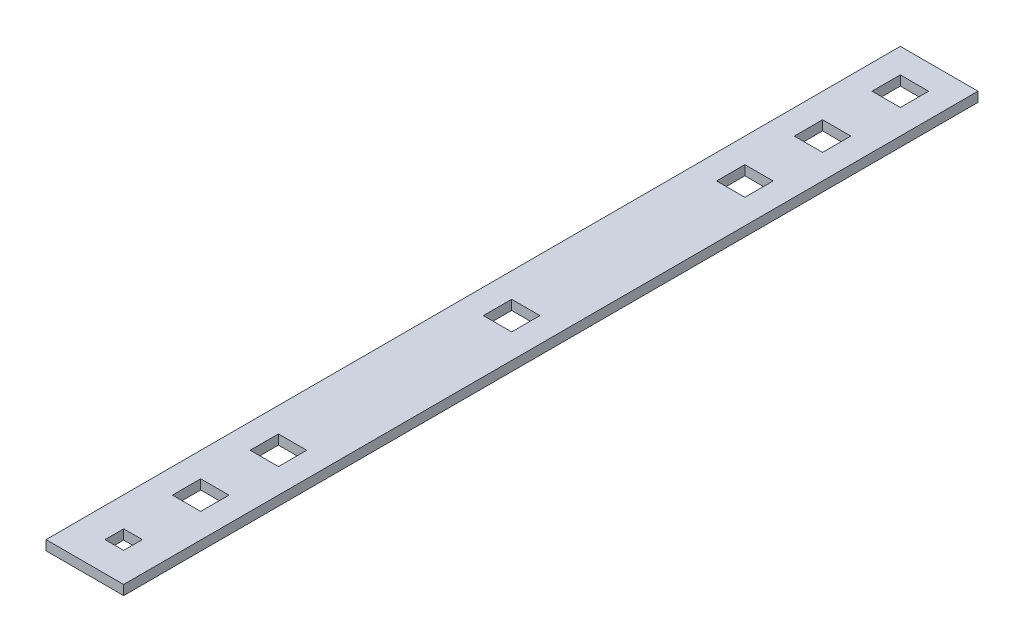
ISO-10303-21;
HEADER;
FILE_DESCRIPTION(('STEP AP214'),'2;1');
FILE_NAME('part.step','',(''),(''),'','','');
FILE_SCHEMA(('AUTOMOTIVE_DESIGN { 1 0 10303 214 1 1 1 1 }'));
ENDSEC;
DATA;
#1=APPLICATION_CONTEXT('core data for automotive mechanical design processes');
#2=APPLICATION_PROTOCOL_DEFINITION('international standard','automotive_design',2000,#1);
#3=PRODUCT_CONTEXT('',#1,'mechanical');
#4=PRODUCT('Part','Part','',(#3));
#5=PRODUCT_RELATED_PRODUCT_CATEGORY('part','',(#4));
#6=PRODUCT_DEFINITION_FORMATION('','',#4);
#7=PRODUCT_DEFINITION_CONTEXT('part definition',#1,'design');
#8=PRODUCT_DEFINITION('design','',#6,#7);
#9=PRODUCT_DEFINITION_SHAPE('','',#8);
#10=(LENGTH_UNIT() NAMED_UNIT(*) SI_UNIT(.MILLI.,.METRE.));
#11=(NAMED_UNIT(*) PLANE_ANGLE_UNIT() SI_UNIT($,.RADIAN.));
#12=(NAMED_UNIT(*) SI_UNIT($,.STERADIAN.) SOLID_ANGLE_UNIT());
#13=UNCERTAINTY_MEASURE_WITH_UNIT(LENGTH_MEASURE(1.E-05),#10,'distance_accuracy_value','');
#14=(GEOMETRIC_REPRESENTATION_CONTEXT(3) GLOBAL_UNCERTAINTY_ASSIGNED_CONTEXT((#13)) GLOBAL_UNIT_ASSIGNED_CONTEXT((#10,
#11,#12)) REPRESENTATION_CONTEXT('',''));
#15=CARTESIAN_POINT('',(0.,0.,0.));
#16=DIRECTION('',(0.,0.,1.));
#17=DIRECTION('',(1.,0.,0.));
#18=AXIS2_PLACEMENT_3D('',#15,#16,#17);
#19=CARTESIAN_POINT('',(0.,1.5875,0.));
#20=DIRECTION('',(0.,1.,0.));
#21=DIRECTION('',(0.,0.,1.));
#22=AXIS2_PLACEMENT_3D('',#19,#20,#21);
#23=PLANE('',#22);
#24=DIRECTION('',(0.,0.,1.));
#25=VECTOR('',#24,1.);
#26=CARTESIAN_POINT('',(-0.0370878442756614,1.5875,-101.537542425712));
#27=LINE('',#26,#25);
#28=CARTESIAN_POINT('',(-0.0370878442756614,1.5875,-101.537542425712));
#29=VERTEX_POINT('',#28);
#30=CARTESIAN_POINT('',(-0.0370878442756614,1.5875,38.1624575742885));
#31=VERTEX_POINT('',#30);
#32=EDGE_CURVE('E466',#29,#31,#27,.T.);
#33=ORIENTED_EDGE('',*,*,#32,.T.);
#34=DIRECTION('',(1.,0.,0.));
#35=VECTOR('',#34,1.);
#36=CARTESIAN_POINT('',(-0.0370878442756614,1.5875,38.1624575742885));
#37=LINE('',#36,#35);
#38=CARTESIAN_POINT('',(12.6629121557243,1.5875,38.1624575742885));
#39=VERTEX_POINT('',#38);
#40=EDGE_CURVE('E469',#31,#39,#37,.T.);
#41=ORIENTED_EDGE('',*,*,#40,.T.);
#42=DIRECTION('',(0.,0.,-1.));
#43=VECTOR('',#42,1.);
#44=CARTESIAN_POINT('',(12.6629121557243,1.5875,-101.537542425712));
#45=LINE('',#44,#43);
#46=CARTESIAN_POINT('',(12.6629121557243,1.5875,-101.537542425712));
#47=VERTEX_POINT('',#46);
#48=EDGE_CURVE('E472',#39,#47,#45,.T.);
#49=ORIENTED_EDGE('',*,*,#48,.T.);
#50=DIRECTION('',(-1.,0.,0.));
#51=VECTOR('',#50,1.);
#52=CARTESIAN_POINT('',(-0.0370878442756614,1.5875,-101.537542425712));
#53=LINE('',#52,#51);
#54=EDGE_CURVE('E474',#47,#29,#53,.T.);
#55=ORIENTED_EDGE('',*,*,#54,.T.);
#56=EDGE_LOOP('',(#33,#41,#49,#55));
#57=FACE_BOUND('',#56,.T.);
#58=DIRECTION('',(1.,0.,0.));
#59=VECTOR('',#58,1.);
#60=CARTESIAN_POINT('',(4.00011215572342,1.5875,-92.8747424257115));
#61=LINE('',#60,#59);
#62=CARTESIAN_POINT('',(4.00011215572342,1.5875,-92.8747424257115));
#63=VERTEX_POINT('',#62);
#64=CARTESIAN_POINT('',(8.62291215572434,1.5875,-92.8747424257115));
#65=VERTEX_POINT('',#64);
#66=EDGE_CURVE('E437',#63,#65,#61,.T.);
#67=ORIENTED_EDGE('',*,*,#66,.F.);
#68=DIRECTION('',(-1.99259791845567E-13,0.,1.));
#69=VECTOR('',#68,1.);
#70=CARTESIAN_POINT('',(4.00011215572434,1.5875,-97.4975424257115));
#71=LINE('',#70,#69);
#72=CARTESIAN_POINT('',(4.00011215572434,1.5875,-97.4975424257115));
#73=VERTEX_POINT('',#72);
#74=EDGE_CURVE('E435',#73,#63,#71,.T.);
#75=ORIENTED_EDGE('',*,*,#74,.F.);
#76=DIRECTION('',(-1.,0.,0.));
#77=VECTOR('',#76,1.);
#78=CARTESIAN_POINT('',(4.00011215572434,1.5875,-97.4975424257115));
#79=LINE('',#78,#77);
#80=CARTESIAN_POINT('',(8.62291215572434,1.5875,-97.4975424257115));
#81=VERTEX_POINT('',#80);
#82=EDGE_CURVE('E443',#81,#73,#79,.T.);
#83=ORIENTED_EDGE('',*,*,#82,.F.);
#84=DIRECTION('',(0.,0.,-1.));
#85=VECTOR('',#84,1.);
#86=CARTESIAN_POINT('',(8.62291215572434,1.5875,-97.4975424257115));
#87=LINE('',#86,#85);
#88=EDGE_CURVE('E440',#65,#81,#87,.T.);
#89=ORIENTED_EDGE('',*,*,#88,.F.);
#90=EDGE_LOOP('',(#67,#75,#83,#89));
#91=FACE_BOUND('',#90,.T.);
#92=DIRECTION('',(1.,0.,0.));
#93=VECTOR('',#92,1.);
#94=CARTESIAN_POINT('',(4.78991215572435,1.5875,33.3374575742885));
#95=LINE('',#94,#93);
#96=CARTESIAN_POINT('',(4.78991215572435,1.5875,33.3374575742885));
#97=VERTEX_POINT('',#96);
#98=CARTESIAN_POINT('',(7.83791215572435,1.5875,33.3374575742885));
#99=VERTEX_POINT('',#98);
#100=EDGE_CURVE('E406',#97,#99,#95,.T.);
#101=ORIENTED_EDGE('',*,*,#100,.F.);
#102=DIRECTION('',(0.,0.,1.));
#103=VECTOR('',#102,1.);
#104=CARTESIAN_POINT('',(4.78991215572435,1.5875,30.2894575742885));
#105=LINE('',#104,#103);
#106=CARTESIAN_POINT('',(4.78991215572435,1.5875,30.2894575742885));
#107=VERTEX_POINT('',#106);
#108=EDGE_CURVE('E404',#107,#97,#105,.T.);
#109=ORIENTED_EDGE('',*,*,#108,.F.);
#110=DIRECTION('',(-1.,0.,0.));
#111=VECTOR('',#110,1.);
#112=CARTESIAN_POINT('',(4.78991215572435,1.5875,30.2894575742885));
#113=LINE('',#112,#111);
#114=CARTESIAN_POINT('',(7.83791215572435,1.5875,30.2894575742885));
#115=VERTEX_POINT('',#114);
#116=EDGE_CURVE('E412',#115,#107,#113,.T.);
#117=ORIENTED_EDGE('',*,*,#116,.F.);
#118=DIRECTION('',(0.,0.,-1.));
#119=VECTOR('',#118,1.);
#120=CARTESIAN_POINT('',(7.83791215572435,1.5875,30.2894575742885));
#121=LINE('',#120,#119);
#122=EDGE_CURVE('E409',#99,#115,#121,.T.);
#123=ORIENTED_EDGE('',*,*,#122,.F.);
#124=EDGE_LOOP('',(#101,#109,#117,#123));
#125=FACE_BOUND('',#124,.T.);
#126=DIRECTION('',(-1.99259791845567E-13,0.,1.));
#127=VECTOR('',#126,1.);
#128=CARTESIAN_POINT('',(4.00011215572447,1.5875,-84.7862636482007));
#129=LINE('',#128,#127);
#130=CARTESIAN_POINT('',(4.00011215572447,1.5875,-84.7862636482007));
#131=VERTEX_POINT('',#130);
#132=CARTESIAN_POINT('',(4.00011215572355,1.5875,-80.1634636482007));
#133=VERTEX_POINT('',#132);
#134=EDGE_CURVE('E375',#131,#133,#129,.T.);
#135=ORIENTED_EDGE('',*,*,#134,.F.);
#136=DIRECTION('',(-1.,0.,0.));
#137=VECTOR('',#136,1.);
#138=CARTESIAN_POINT('',(4.00011215572447,1.5875,-84.7862636482007));
#139=LINE('',#138,#137);
#140=CARTESIAN_POINT('',(8.62291215572447,1.5875,-84.7862636482007));
#141=VERTEX_POINT('',#140);
#142=EDGE_CURVE('E373',#141,#131,#139,.T.);
#143=ORIENTED_EDGE('',*,*,#142,.F.);
#144=DIRECTION('',(0.,0.,-1.));
#145=VECTOR('',#144,1.);
#146=CARTESIAN_POINT('',(8.62291215572447,1.5875,-84.7862636482007));
#147=LINE('',#146,#145);
#148=CARTESIAN_POINT('',(8.62291215572447,1.5875,-80.1634636482007));
#149=VERTEX_POINT('',#148);
#150=EDGE_CURVE('E381',#149,#141,#147,.T.);
#151=ORIENTED_EDGE('',*,*,#150,.F.);
#152=DIRECTION('',(1.,0.,0.));
#153=VECTOR('',#152,1.);
#154=CARTESIAN_POINT('',(4.00011215572355,1.5875,-80.1634636482007));
#155=LINE('',#154,#153);
#156=EDGE_CURVE('E378',#133,#149,#155,.T.);
#157=ORIENTED_EDGE('',*,*,#156,.F.);
#158=EDGE_LOOP('',(#135,#143,#151,#157));
#159=FACE_BOUND('',#158,.T.);
#160=DIRECTION('',(-1.99259791845567E-13,0.,1.));
#161=VECTOR('',#160,1.);
#162=CARTESIAN_POINT('',(4.0001121557246,1.5875,-72.0749848706899));
#163=LINE('',#162,#161);
#164=CARTESIAN_POINT('',(4.0001121557246,1.5875,-72.0749848706899));
#165=VERTEX_POINT('',#164);
#166=CARTESIAN_POINT('',(4.00011215572368,1.5875,-67.4521848706899));
#167=VERTEX_POINT('',#166);
#168=EDGE_CURVE('E344',#165,#167,#163,.T.);
#169=ORIENTED_EDGE('',*,*,#168,.F.);
#170=DIRECTION('',(-1.,0.,0.));
#171=VECTOR('',#170,1.);
#172=CARTESIAN_POINT('',(4.0001121557246,1.5875,-72.0749848706899));
#173=LINE('',#172,#171);
#174=CARTESIAN_POINT('',(8.6229121557246,1.5875,-72.0749848706899));
#175=VERTEX_POINT('',#174);
#176=EDGE_CURVE('E342',#175,#165,#173,.T.);
#177=ORIENTED_EDGE('',*,*,#176,.F.);
#178=DIRECTION('',(0.,0.,-1.));
#179=VECTOR('',#178,1.);
#180=CARTESIAN_POINT('',(8.6229121557246,1.5875,-72.0749848706899));
#181=LINE('',#180,#179);
#182=CARTESIAN_POINT('',(8.6229121557246,1.5875,-67.4521848706899));
#183=VERTEX_POINT('',#182);
#184=EDGE_CURVE('E350',#183,#175,#181,.T.);
#185=ORIENTED_EDGE('',*,*,#184,.F.);
#186=DIRECTION('',(1.,0.,0.));
#187=VECTOR('',#186,1.);
#188=CARTESIAN_POINT('',(4.00011215572368,1.5875,-67.4521848706899));
#189=LINE('',#188,#187);
#190=EDGE_CURVE('E347',#167,#183,#189,.T.);
#191=ORIENTED_EDGE('',*,*,#190,.F.);
#192=EDGE_LOOP('',(#169,#177,#185,#191));
#193=FACE_BOUND('',#192,.T.);
#194=DIRECTION('',(-1.99259791845567E-13,0.,1.));
#195=VECTOR('',#194,1.);
#196=CARTESIAN_POINT('',(4.000112155725,1.5875,-33.9411485381575));
#197=LINE('',#196,#195);
#198=CARTESIAN_POINT('',(4.000112155725,1.5875,-33.9411485381575));
#199=VERTEX_POINT('',#198);
#200=CARTESIAN_POINT('',(4.00011215572408,1.5875,-29.3183485381575));
#201=VERTEX_POINT('',#200);
#202=EDGE_CURVE('E313',#199,#201,#197,.T.);
#203=ORIENTED_EDGE('',*,*,#202,.F.);
#204=DIRECTION('',(-1.,0.,0.));
#205=VECTOR('',#204,1.);
#206=CARTESIAN_POINT('',(4.000112155725,1.5875,-33.9411485381575));
#207=LINE('',#206,#205);
#208=CARTESIAN_POINT('',(8.622912155725,1.5875,-33.9411485381575));
#209=VERTEX_POINT('',#208);
#210=EDGE_CURVE('E311',#209,#199,#207,.T.);
#211=ORIENTED_EDGE('',*,*,#210,.F.);
#212=DIRECTION('',(0.,0.,-1.));
#213=VECTOR('',#212,1.);
#214=CARTESIAN_POINT('',(8.622912155725,1.5875,-33.9411485381575));
#215=LINE('',#214,#213);
#216=CARTESIAN_POINT('',(8.622912155725,1.5875,-29.3183485381575));
#217=VERTEX_POINT('',#216);
#218=EDGE_CURVE('E319',#217,#209,#215,.T.);
#219=ORIENTED_EDGE('',*,*,#218,.F.);
#220=DIRECTION('',(1.,0.,0.));
#221=VECTOR('',#220,1.);
#222=CARTESIAN_POINT('',(4.00011215572408,1.5875,-29.3183485381575));
#223=LINE('',#222,#221);
#224=EDGE_CURVE('E316',#201,#217,#223,.T.);
#225=ORIENTED_EDGE('',*,*,#224,.F.);
#226=EDGE_LOOP('',(#203,#211,#219,#225));
#227=FACE_BOUND('',#226,.T.);
#228=DIRECTION('',(-1.99259791845567E-13,0.,1.));
#229=VECTOR('',#228,1.);
#230=CARTESIAN_POINT('',(4.0001121557254,1.5875,4.19268779437487));
#231=LINE('',#230,#229);
#232=CARTESIAN_POINT('',(4.0001121557254,1.5875,4.19268779437487));
#233=VERTEX_POINT('',#232);
#234=CARTESIAN_POINT('',(4.00011215572448,1.5875,8.81548779437487));
#235=VERTEX_POINT('',#234);
#236=EDGE_CURVE('E282',#233,#235,#231,.T.);
#237=ORIENTED_EDGE('',*,*,#236,.F.);
#238=DIRECTION('',(-1.,0.,0.));
#239=VECTOR('',#238,1.);
#240=CARTESIAN_POINT('',(4.0001121557254,1.5875,4.19268779437487));
#241=LINE('',#240,#239);
#242=CARTESIAN_POINT('',(8.6229121557254,1.5875,4.19268779437487));
#243=VERTEX_POINT('',#242);
#244=EDGE_CURVE('E280',#243,#233,#241,.T.);
#245=ORIENTED_EDGE('',*,*,#244,.F.);
#246=DIRECTION('',(0.,0.,-1.));
#247=VECTOR('',#246,1.);
#248=CARTESIAN_POINT('',(8.6229121557254,1.5875,4.19268779437487));
#249=LINE('',#248,#247);
#250=CARTESIAN_POINT('',(8.6229121557254,1.5875,8.81548779437487));
#251=VERTEX_POINT('',#250);
#252=EDGE_CURVE('E288',#251,#243,#249,.T.);
#253=ORIENTED_EDGE('',*,*,#252,.F.);
#254=DIRECTION('',(1.,0.,0.));
#255=VECTOR('',#254,1.);
#256=CARTESIAN_POINT('',(4.00011215572448,1.5875,8.81548779437487));
#257=LINE('',#256,#255);
#258=EDGE_CURVE('E285',#235,#251,#257,.T.);
#259=ORIENTED_EDGE('',*,*,#258,.F.);
#260=EDGE_LOOP('',(#237,#245,#253,#259));
#261=FACE_BOUND('',#260,.T.);
#262=DIRECTION('',(-1.99259791845567E-13,0.,1.));
#263=VECTOR('',#262,1.);
#264=CARTESIAN_POINT('',(4.00011215572554,1.5875,16.9039665718857));
#265=LINE('',#264,#263);
#266=CARTESIAN_POINT('',(4.00011215572554,1.5875,16.9039665718857));
#267=VERTEX_POINT('',#266);
#268=CARTESIAN_POINT('',(4.00011215572462,1.5875,21.5267665718857));
#269=VERTEX_POINT('',#268);
#270=EDGE_CURVE('E252',#267,#269,#265,.T.);
#271=ORIENTED_EDGE('',*,*,#270,.F.);
#272=DIRECTION('',(-1.,0.,0.));
#273=VECTOR('',#272,1.);
#274=CARTESIAN_POINT('',(4.00011215572554,1.5875,16.9039665718857));
#275=LINE('',#274,#273);
#276=CARTESIAN_POINT('',(8.62291215572554,1.5875,16.9039665718857));
#277=VERTEX_POINT('',#276);
#278=EDGE_CURVE('E244',#277,#267,#275,.T.);
#279=ORIENTED_EDGE('',*,*,#278,.F.);
#280=DIRECTION('',(0.,0.,-1.));
#281=VECTOR('',#280,1.);
#282=CARTESIAN_POINT('',(8.62291215572554,1.5875,16.9039665718857));
#283=LINE('',#282,#281);
#284=CARTESIAN_POINT('',(8.62291215572554,1.5875,21.5267665718857));
#285=VERTEX_POINT('',#284);
#286=EDGE_CURVE('E266',#285,#277,#283,.T.);
#287=ORIENTED_EDGE('',*,*,#286,.F.);
#288=DIRECTION('',(1.,0.,0.));
#289=VECTOR('',#288,1.);
#290=CARTESIAN_POINT('',(4.00011215572462,1.5875,21.5267665718857));
#291=LINE('',#290,#289);
#292=EDGE_CURVE('E264',#269,#285,#291,.T.);
#293=ORIENTED_EDGE('',*,*,#292,.F.);
#294=EDGE_LOOP('',(#271,#279,#287,#293));
#295=FACE_BOUND('',#294,.T.);
#296=ADVANCED_FACE('F35',(#57,#91,#125,#159,#193,#227,#261,#295),#23,.T.);
#297=CARTESIAN_POINT('',(0.,0.,0.));
#298=DIRECTION('',(0.,1.,0.));
#299=DIRECTION('',(0.,0.,1.));
#300=AXIS2_PLACEMENT_3D('',#297,#298,#299);
#301=PLANE('',#300);
#302=DIRECTION('',(-1.,0.,0.));
#303=VECTOR('',#302,1.);
#304=CARTESIAN_POINT('',(4.0001121557254,0.,4.19268779437487));
#305=LINE('',#304,#303);
#306=CARTESIAN_POINT('',(8.6229121557254,0.,4.19268779437487));
#307=VERTEX_POINT('',#306);
#308=CARTESIAN_POINT('',(4.0001121557254,0.,4.19268779437487));
#309=VERTEX_POINT('',#308);
#310=EDGE_CURVE('E260',#307,#309,#305,.T.);
#311=ORIENTED_EDGE('',*,*,#310,.T.);
#312=DIRECTION('',(-1.99259791845567E-13,0.,1.));
#313=VECTOR('',#312,1.);
#314=CARTESIAN_POINT('',(4.0001121557254,0.,4.19268779437487));
#315=LINE('',#314,#313);
#316=CARTESIAN_POINT('',(4.00011215572448,0.,8.81548779437487));
#317=VERTEX_POINT('',#316);
#318=EDGE_CURVE('E293',#309,#317,#315,.T.);
#319=ORIENTED_EDGE('',*,*,#318,.T.);
#320=DIRECTION('',(1.,0.,0.));
#321=VECTOR('',#320,1.);
#322=CARTESIAN_POINT('',(4.00011215572448,0.,8.81548779437487));
#323=LINE('',#322,#321);
#324=CARTESIAN_POINT('',(8.6229121557254,0.,8.81548779437487));
#325=VERTEX_POINT('',#324);
#326=EDGE_CURVE('E296',#317,#325,#323,.T.);
#327=ORIENTED_EDGE('',*,*,#326,.T.);
#328=DIRECTION('',(0.,0.,-1.));
#329=VECTOR('',#328,1.);
#330=CARTESIAN_POINT('',(8.6229121557254,0.,4.19268779437487));
#331=LINE('',#330,#329);
#332=EDGE_CURVE('E283',#325,#307,#331,.T.);
#333=ORIENTED_EDGE('',*,*,#332,.T.);
#334=EDGE_LOOP('',(#311,#319,#327,#333));
#335=FACE_BOUND('',#334,.T.);
#336=DIRECTION('',(-1.,0.,0.));
#337=VECTOR('',#336,1.);
#338=CARTESIAN_POINT('',(4.0001121557246,0.,-72.0749848706899));
#339=LINE('',#338,#337);
#340=CARTESIAN_POINT('',(8.6229121557246,0.,-72.0749848706899));
#341=VERTEX_POINT('',#340);
#342=CARTESIAN_POINT('',(4.0001121557246,0.,-72.0749848706899));
#343=VERTEX_POINT('',#342);
#344=EDGE_CURVE('E341',#341,#343,#339,.T.);
#345=ORIENTED_EDGE('',*,*,#344,.T.);
#346=DIRECTION('',(-1.99259791845567E-13,0.,1.));
#347=VECTOR('',#346,1.);
#348=CARTESIAN_POINT('',(4.0001121557246,0.,-72.0749848706899));
#349=LINE('',#348,#347);
#350=CARTESIAN_POINT('',(4.00011215572368,0.,-67.4521848706899));
#351=VERTEX_POINT('',#350);
#352=EDGE_CURVE('E355',#343,#351,#349,.T.);
#353=ORIENTED_EDGE('',*,*,#352,.T.);
#354=DIRECTION('',(1.,0.,0.));
#355=VECTOR('',#354,1.);
#356=CARTESIAN_POINT('',(4.00011215572368,0.,-67.4521848706899));
#357=LINE('',#356,#355);
#358=CARTESIAN_POINT('',(8.6229121557246,0.,-67.4521848706899));
#359=VERTEX_POINT('',#358);
#360=EDGE_CURVE('E358',#351,#359,#357,.T.);
#361=ORIENTED_EDGE('',*,*,#360,.T.);
#362=DIRECTION('',(0.,0.,-1.));
#363=VECTOR('',#362,1.);
#364=CARTESIAN_POINT('',(8.6229121557246,0.,-72.0749848706899));
#365=LINE('',#364,#363);
#366=EDGE_CURVE('E345',#359,#341,#365,.T.);
#367=ORIENTED_EDGE('',*,*,#366,.T.);
#368=EDGE_LOOP('',(#345,#353,#361,#367));
#369=FACE_BOUND('',#368,.T.);
#370=DIRECTION('',(0.,0.,1.));
#371=VECTOR('',#370,1.);
#372=CARTESIAN_POINT('',(4.78991215572435,0.,30.2894575742885));
#373=LINE('',#372,#371);
#374=CARTESIAN_POINT('',(4.78991215572435,0.,30.2894575742885));
#375=VERTEX_POINT('',#374);
#376=CARTESIAN_POINT('',(4.78991215572435,0.,33.3374575742885));
#377=VERTEX_POINT('',#376);
#378=EDGE_CURVE('E403',#375,#377,#373,.T.);
#379=ORIENTED_EDGE('',*,*,#378,.T.);
#380=DIRECTION('',(1.,0.,0.));
#381=VECTOR('',#380,1.);
#382=CARTESIAN_POINT('',(4.78991215572435,0.,33.3374575742885));
#383=LINE('',#382,#381);
#384=CARTESIAN_POINT('',(7.83791215572435,0.,33.3374575742885));
#385=VERTEX_POINT('',#384);
#386=EDGE_CURVE('E417',#377,#385,#383,.T.);
#387=ORIENTED_EDGE('',*,*,#386,.T.);
#388=DIRECTION('',(0.,0.,-1.));
#389=VECTOR('',#388,1.);
#390=CARTESIAN_POINT('',(7.83791215572435,0.,30.2894575742885));
#391=LINE('',#390,#389);
#392=CARTESIAN_POINT('',(7.83791215572435,0.,30.2894575742885));
#393=VERTEX_POINT('',#392);
#394=EDGE_CURVE('E420',#385,#393,#391,.T.);
#395=ORIENTED_EDGE('',*,*,#394,.T.);
#396=DIRECTION('',(-1.,0.,0.));
#397=VECTOR('',#396,1.);
#398=CARTESIAN_POINT('',(4.78991215572435,0.,30.2894575742885));
#399=LINE('',#398,#397);
#400=EDGE_CURVE('E407',#393,#375,#399,.T.);
#401=ORIENTED_EDGE('',*,*,#400,.T.);
#402=EDGE_LOOP('',(#379,#387,#395,#401));
#403=FACE_BOUND('',#402,.T.);
#404=DIRECTION('',(0.,0.,1.));
#405=VECTOR('',#404,1.);
#406=CARTESIAN_POINT('',(-0.0370878442756614,0.,-101.537542425712));
#407=LINE('',#406,#405);
#408=CARTESIAN_POINT('',(-0.0370878442756614,0.,-101.537542425712));
#409=VERTEX_POINT('',#408);
#410=CARTESIAN_POINT('',(-0.0370878442756614,0.,38.1624575742885));
#411=VERTEX_POINT('',#410);
#412=EDGE_CURVE('E465',#409,#411,#407,.T.);
#413=ORIENTED_EDGE('',*,*,#412,.F.);
#414=DIRECTION('',(-1.,0.,0.));
#415=VECTOR('',#414,1.);
#416=CARTESIAN_POINT('',(-0.0370878442756614,0.,-101.537542425712));
#417=LINE('',#416,#415);
#418=CARTESIAN_POINT('',(12.6629121557243,0.,-101.537542425712));
#419=VERTEX_POINT('',#418);
#420=EDGE_CURVE('E470',#419,#409,#417,.T.);
#421=ORIENTED_EDGE('',*,*,#420,.F.);
#422=DIRECTION('',(0.,0.,-1.));
#423=VECTOR('',#422,1.);
#424=CARTESIAN_POINT('',(12.6629121557243,0.,-101.537542425712));
#425=LINE('',#424,#423);
#426=CARTESIAN_POINT('',(12.6629121557243,0.,38.1624575742885));
#427=VERTEX_POINT('',#426);
#428=EDGE_CURVE('E481',#427,#419,#425,.T.);
#429=ORIENTED_EDGE('',*,*,#428,.F.);
#430=DIRECTION('',(1.,0.,0.));
#431=VECTOR('',#430,1.);
#432=CARTESIAN_POINT('',(-0.0370878442756614,0.,38.1624575742885));
#433=LINE('',#432,#431);
#434=EDGE_CURVE('E479',#411,#427,#433,.T.);
#435=ORIENTED_EDGE('',*,*,#434,.F.);
#436=EDGE_LOOP('',(#413,#421,#429,#435));
#437=FACE_BOUND('',#436,.T.);
#438=DIRECTION('',(-1.99259791845567E-13,0.,1.));
#439=VECTOR('',#438,1.);
#440=CARTESIAN_POINT('',(4.00011215572434,0.,-97.4975424257115));
#441=LINE('',#440,#439);
#442=CARTESIAN_POINT('',(4.00011215572434,0.,-97.4975424257115));
#443=VERTEX_POINT('',#442);
#444=CARTESIAN_POINT('',(4.00011215572342,0.,-92.8747424257115));
#445=VERTEX_POINT('',#444);
#446=EDGE_CURVE('E434',#443,#445,#441,.T.);
#447=ORIENTED_EDGE('',*,*,#446,.T.);
#448=DIRECTION('',(1.,0.,0.));
#449=VECTOR('',#448,1.);
#450=CARTESIAN_POINT('',(4.00011215572342,0.,-92.8747424257115));
#451=LINE('',#450,#449);
#452=CARTESIAN_POINT('',(8.62291215572434,0.,-92.8747424257115));
#453=VERTEX_POINT('',#452);
#454=EDGE_CURVE('E448',#445,#453,#451,.T.);
#455=ORIENTED_EDGE('',*,*,#454,.T.);
#456=DIRECTION('',(0.,0.,-1.));
#457=VECTOR('',#456,1.);
#458=CARTESIAN_POINT('',(8.62291215572434,0.,-97.4975424257115));
#459=LINE('',#458,#457);
#460=CARTESIAN_POINT('',(8.62291215572434,0.,-97.4975424257115));
#461=VERTEX_POINT('',#460);
#462=EDGE_CURVE('E451',#453,#461,#459,.T.);
#463=ORIENTED_EDGE('',*,*,#462,.T.);
#464=DIRECTION('',(-1.,0.,0.));
#465=VECTOR('',#464,1.);
#466=CARTESIAN_POINT('',(4.00011215572434,0.,-97.4975424257115));
#467=LINE('',#466,#465);
#468=EDGE_CURVE('E438',#461,#443,#467,.T.);
#469=ORIENTED_EDGE('',*,*,#468,.T.);
#470=EDGE_LOOP('',(#447,#455,#463,#469));
#471=FACE_BOUND('',#470,.T.);
#472=DIRECTION('',(-1.,0.,0.));
#473=VECTOR('',#472,1.);
#474=CARTESIAN_POINT('',(4.00011215572447,0.,-84.7862636482007));
#475=LINE('',#474,#473);
#476=CARTESIAN_POINT('',(8.62291215572447,0.,-84.7862636482007));
#477=VERTEX_POINT('',#476);
#478=CARTESIAN_POINT('',(4.00011215572447,0.,-84.7862636482007));
#479=VERTEX_POINT('',#478);
#480=EDGE_CURVE('E372',#477,#479,#475,.T.);
#481=ORIENTED_EDGE('',*,*,#480,.T.);
#482=DIRECTION('',(-1.99259791845567E-13,0.,1.));
#483=VECTOR('',#482,1.);
#484=CARTESIAN_POINT('',(4.00011215572447,0.,-84.7862636482007));
#485=LINE('',#484,#483);
#486=CARTESIAN_POINT('',(4.00011215572355,0.,-80.1634636482007));
#487=VERTEX_POINT('',#486);
#488=EDGE_CURVE('E386',#479,#487,#485,.T.);
#489=ORIENTED_EDGE('',*,*,#488,.T.);
#490=DIRECTION('',(1.,0.,0.));
#491=VECTOR('',#490,1.);
#492=CARTESIAN_POINT('',(4.00011215572355,0.,-80.1634636482007));
#493=LINE('',#492,#491);
#494=CARTESIAN_POINT('',(8.62291215572447,0.,-80.1634636482007));
#495=VERTEX_POINT('',#494);
#496=EDGE_CURVE('E389',#487,#495,#493,.T.);
#497=ORIENTED_EDGE('',*,*,#496,.T.);
#498=DIRECTION('',(0.,0.,-1.));
#499=VECTOR('',#498,1.);
#500=CARTESIAN_POINT('',(8.62291215572447,0.,-84.7862636482007));
#501=LINE('',#500,#499);
#502=EDGE_CURVE('E376',#495,#477,#501,.T.);
#503=ORIENTED_EDGE('',*,*,#502,.T.);
#504=EDGE_LOOP('',(#481,#489,#497,#503));
#505=FACE_BOUND('',#504,.T.);
#506=DIRECTION('',(-1.,0.,0.));
#507=VECTOR('',#506,1.);
#508=CARTESIAN_POINT('',(4.000112155725,0.,-33.9411485381575));
#509=LINE('',#508,#507);
#510=CARTESIAN_POINT('',(8.622912155725,0.,-33.9411485381575));
#511=VERTEX_POINT('',#510);
#512=CARTESIAN_POINT('',(4.000112155725,0.,-33.9411485381575));
#513=VERTEX_POINT('',#512);
#514=EDGE_CURVE('E310',#511,#513,#509,.T.);
#515=ORIENTED_EDGE('',*,*,#514,.T.);
#516=DIRECTION('',(-1.99259791845567E-13,0.,1.));
#517=VECTOR('',#516,1.);
#518=CARTESIAN_POINT('',(4.000112155725,0.,-33.9411485381575));
#519=LINE('',#518,#517);
#520=CARTESIAN_POINT('',(4.00011215572408,0.,-29.3183485381575));
#521=VERTEX_POINT('',#520);
#522=EDGE_CURVE('E324',#513,#521,#519,.T.);
#523=ORIENTED_EDGE('',*,*,#522,.T.);
#524=DIRECTION('',(1.,0.,0.));
#525=VECTOR('',#524,1.);
#526=CARTESIAN_POINT('',(4.00011215572408,0.,-29.3183485381575));
#527=LINE('',#526,#525);
#528=CARTESIAN_POINT('',(8.622912155725,0.,-29.3183485381575));
#529=VERTEX_POINT('',#528);
#530=EDGE_CURVE('E327',#521,#529,#527,.T.);
#531=ORIENTED_EDGE('',*,*,#530,.T.);
#532=DIRECTION('',(0.,0.,-1.));
#533=VECTOR('',#532,1.);
#534=CARTESIAN_POINT('',(8.622912155725,0.,-33.9411485381575));
#535=LINE('',#534,#533);
#536=EDGE_CURVE('E314',#529,#511,#535,.T.);
#537=ORIENTED_EDGE('',*,*,#536,.T.);
#538=EDGE_LOOP('',(#515,#523,#531,#537));
#539=FACE_BOUND('',#538,.T.);
#540=DIRECTION('',(-1.,0.,0.));
#541=VECTOR('',#540,1.);
#542=CARTESIAN_POINT('',(4.00011215572554,0.,16.9039665718857));
#543=LINE('',#542,#541);
#544=CARTESIAN_POINT('',(8.62291215572554,0.,16.9039665718857));
#545=VERTEX_POINT('',#544);
#546=CARTESIAN_POINT('',(4.00011215572554,0.,16.9039665718857));
#547=VERTEX_POINT('',#546);
#548=EDGE_CURVE('E58',#545,#547,#543,.T.);
#549=ORIENTED_EDGE('',*,*,#548,.T.);
#550=DIRECTION('',(-1.99259791845567E-13,0.,1.));
#551=VECTOR('',#550,1.);
#552=CARTESIAN_POINT('',(4.00011215572554,0.,16.9039665718857));
#553=LINE('',#552,#551);
#554=CARTESIAN_POINT('',(4.00011215572462,0.,21.5267665718857));
#555=VERTEX_POINT('',#554);
#556=EDGE_CURVE('E259',#547,#555,#553,.T.);
#557=ORIENTED_EDGE('',*,*,#556,.T.);
#558=DIRECTION('',(1.,0.,0.));
#559=VECTOR('',#558,1.);
#560=CARTESIAN_POINT('',(4.00011215572462,0.,21.5267665718857));
#561=LINE('',#560,#559);
#562=CARTESIAN_POINT('',(8.62291215572554,0.,21.5267665718857));
#563=VERTEX_POINT('',#562);
#564=EDGE_CURVE('E272',#555,#563,#561,.T.);
#565=ORIENTED_EDGE('',*,*,#564,.T.);
#566=DIRECTION('',(0.,0.,-1.));
#567=VECTOR('',#566,1.);
#568=CARTESIAN_POINT('',(8.62291215572554,0.,16.9039665718857));
#569=LINE('',#568,#567);
#570=EDGE_CURVE('E253',#563,#545,#569,.T.);
#571=ORIENTED_EDGE('',*,*,#570,.T.);
#572=EDGE_LOOP('',(#549,#557,#565,#571));
#573=FACE_BOUND('',#572,.T.);
#574=ADVANCED_FACE('F499',(#335,#369,#403,#437,#471,#505,#539,#573),#301,.F.);
#575=CARTESIAN_POINT('',(-0.0370878442756614,1.5875,-101.537542425712));
#576=DIRECTION('',(1.,0.,0.));
#577=DIRECTION('',(0.,0.,-1.));
#578=AXIS2_PLACEMENT_3D('',#575,#576,#577);
#579=PLANE('',#578);
#580=ORIENTED_EDGE('',*,*,#412,.T.);
#581=DIRECTION('',(0.,-1.,0.));
#582=VECTOR('',#581,1.);
#583=CARTESIAN_POINT('',(-0.0370878442756614,1.5875,38.1624575742885));
#584=LINE('',#583,#582);
#585=EDGE_CURVE('E11',#31,#411,#584,.T.);
#586=ORIENTED_EDGE('',*,*,#585,.F.);
#587=ORIENTED_EDGE('',*,*,#32,.F.);
#588=DIRECTION('',(0.,-1.,0.));
#589=VECTOR('',#588,1.);
#590=CARTESIAN_POINT('',(-0.0370878442756614,1.5875,-101.537542425712));
#591=LINE('',#590,#589);
#592=EDGE_CURVE('E476',#29,#409,#591,.T.);
#593=ORIENTED_EDGE('',*,*,#592,.T.);
#594=EDGE_LOOP('',(#580,#586,#587,#593));
#595=FACE_BOUND('',#594,.T.);
#596=ADVANCED_FACE('F37',(#595),#579,.F.);
#597=CARTESIAN_POINT('',(-0.0370878442756614,1.5875,38.1624575742885));
#598=DIRECTION('',(0.,0.,-1.));
#599=DIRECTION('',(-1.,0.,0.));
#600=AXIS2_PLACEMENT_3D('',#597,#598,#599);
#601=PLANE('',#600);
#602=ORIENTED_EDGE('',*,*,#434,.T.);
#603=DIRECTION('',(0.,-1.,0.));
#604=VECTOR('',#603,1.);
#605=CARTESIAN_POINT('',(12.6629121557243,1.5875,38.1624575742885));
#606=LINE('',#605,#604);
#607=EDGE_CURVE('E43',#39,#427,#606,.T.);
#608=ORIENTED_EDGE('',*,*,#607,.F.);
#609=ORIENTED_EDGE('',*,*,#40,.F.);
#610=ORIENTED_EDGE('',*,*,#585,.T.);
#611=EDGE_LOOP('',(#602,#608,#609,#610));
#612=FACE_BOUND('',#611,.T.);
#613=ADVANCED_FACE('F510',(#612),#601,.F.);
#614=CARTESIAN_POINT('',(12.6629121557243,1.5875,-101.537542425712));
#615=DIRECTION('',(-1.,0.,0.));
#616=DIRECTION('',(0.,0.,1.));
#617=AXIS2_PLACEMENT_3D('',#614,#615,#616);
#618=PLANE('',#617);
#619=ORIENTED_EDGE('',*,*,#428,.T.);
#620=DIRECTION('',(0.,-1.,0.));
#621=VECTOR('',#620,1.);
#622=CARTESIAN_POINT('',(12.6629121557243,1.5875,-101.537542425712));
#623=LINE('',#622,#621);
#624=EDGE_CURVE('E486',#47,#419,#623,.T.);
#625=ORIENTED_EDGE('',*,*,#624,.F.);
#626=ORIENTED_EDGE('',*,*,#48,.F.);
#627=ORIENTED_EDGE('',*,*,#607,.T.);
#628=EDGE_LOOP('',(#619,#625,#626,#627));
#629=FACE_BOUND('',#628,.T.);
#630=ADVANCED_FACE('F493',(#629),#618,.F.);
#631=CARTESIAN_POINT('',(-0.0370878442756614,1.5875,-101.537542425712));
#632=DIRECTION('',(0.,0.,1.));
#633=DIRECTION('',(1.,0.,0.));
#634=AXIS2_PLACEMENT_3D('',#631,#632,#633);
#635=PLANE('',#634);
#636=ORIENTED_EDGE('',*,*,#420,.T.);
#637=ORIENTED_EDGE('',*,*,#592,.F.);
#638=ORIENTED_EDGE('',*,*,#54,.F.);
#639=ORIENTED_EDGE('',*,*,#624,.T.);
#640=EDGE_LOOP('',(#636,#637,#638,#639));
#641=FACE_BOUND('',#640,.T.);
#642=ADVANCED_FACE('F503',(#641),#635,.F.);
#643=CARTESIAN_POINT('',(4.00011215572434,1.5875,-97.4975424257115));
#644=DIRECTION('',(1.,0.,1.99259791845567E-13));
#645=DIRECTION('',(1.99259791845567E-13,0.,-1.));
#646=AXIS2_PLACEMENT_3D('',#643,#644,#645);
#647=PLANE('',#646);
#648=ORIENTED_EDGE('',*,*,#446,.F.);
#649=DIRECTION('',(0.,-1.,0.));
#650=VECTOR('',#649,1.);
#651=CARTESIAN_POINT('',(4.00011215572434,1.5875,-97.4975424257115));
#652=LINE('',#651,#650);
#653=EDGE_CURVE('E445',#73,#443,#652,.T.);
#654=ORIENTED_EDGE('',*,*,#653,.F.);
#655=ORIENTED_EDGE('',*,*,#74,.T.);
#656=DIRECTION('',(0.,-1.,0.));
#657=VECTOR('',#656,1.);
#658=CARTESIAN_POINT('',(4.00011215572342,1.5875,-92.8747424257115));
#659=LINE('',#658,#657);
#660=EDGE_CURVE('E462',#63,#445,#659,.T.);
#661=ORIENTED_EDGE('',*,*,#660,.T.);
#662=EDGE_LOOP('',(#648,#654,#655,#661));
#663=FACE_BOUND('',#662,.T.);
#664=ADVANCED_FACE('F525',(#663),#647,.T.);
#665=CARTESIAN_POINT('',(4.00011215572342,1.5875,-92.8747424257115));
#666=DIRECTION('',(0.,0.,-1.));
#667=DIRECTION('',(-1.,0.,0.));
#668=AXIS2_PLACEMENT_3D('',#665,#666,#667);
#669=PLANE('',#668);
#670=ORIENTED_EDGE('',*,*,#454,.F.);
#671=ORIENTED_EDGE('',*,*,#660,.F.);
#672=ORIENTED_EDGE('',*,*,#66,.T.);
#673=DIRECTION('',(0.,-1.,0.));
#674=VECTOR('',#673,1.);
#675=CARTESIAN_POINT('',(8.62291215572434,1.5875,-92.8747424257115));
#676=LINE('',#675,#674);
#677=EDGE_CURVE('E460',#65,#453,#676,.T.);
#678=ORIENTED_EDGE('',*,*,#677,.T.);
#679=EDGE_LOOP('',(#670,#671,#672,#678));
#680=FACE_BOUND('',#679,.T.);
#681=ADVANCED_FACE('F532',(#680),#669,.T.);
#682=CARTESIAN_POINT('',(8.62291215572434,1.5875,-97.4975424257115));
#683=DIRECTION('',(-1.,0.,0.));
#684=DIRECTION('',(0.,0.,1.));
#685=AXIS2_PLACEMENT_3D('',#682,#683,#684);
#686=PLANE('',#685);
#687=ORIENTED_EDGE('',*,*,#462,.F.);
#688=ORIENTED_EDGE('',*,*,#677,.F.);
#689=ORIENTED_EDGE('',*,*,#88,.T.);
#690=DIRECTION('',(0.,-1.,0.));
#691=VECTOR('',#690,1.);
#692=CARTESIAN_POINT('',(8.62291215572434,1.5875,-97.4975424257115));
#693=LINE('',#692,#691);
#694=EDGE_CURVE('E458',#81,#461,#693,.T.);
#695=ORIENTED_EDGE('',*,*,#694,.T.);
#696=EDGE_LOOP('',(#687,#688,#689,#695));
#697=FACE_BOUND('',#696,.T.);
#698=ADVANCED_FACE('F537',(#697),#686,.T.);
#699=CARTESIAN_POINT('',(4.00011215572434,1.5875,-97.4975424257115));
#700=DIRECTION('',(0.,0.,1.));
#701=DIRECTION('',(1.,0.,0.));
#702=AXIS2_PLACEMENT_3D('',#699,#700,#701);
#703=PLANE('',#702);
#704=ORIENTED_EDGE('',*,*,#468,.F.);
#705=ORIENTED_EDGE('',*,*,#694,.F.);
#706=ORIENTED_EDGE('',*,*,#82,.T.);
#707=ORIENTED_EDGE('',*,*,#653,.T.);
#708=EDGE_LOOP('',(#704,#705,#706,#707));
#709=FACE_BOUND('',#708,.T.);
#710=ADVANCED_FACE('F544',(#709),#703,.T.);
#711=CARTESIAN_POINT('',(4.78991215572435,1.5875,30.2894575742885));
#712=DIRECTION('',(1.,0.,0.));
#713=DIRECTION('',(0.,0.,-1.));
#714=AXIS2_PLACEMENT_3D('',#711,#712,#713);
#715=PLANE('',#714);
#716=ORIENTED_EDGE('',*,*,#378,.F.);
#717=DIRECTION('',(0.,-1.,0.));
#718=VECTOR('',#717,1.);
#719=CARTESIAN_POINT('',(4.78991215572435,1.5875,30.2894575742885));
#720=LINE('',#719,#718);
#721=EDGE_CURVE('E414',#107,#375,#720,.T.);
#722=ORIENTED_EDGE('',*,*,#721,.F.);
#723=ORIENTED_EDGE('',*,*,#108,.T.);
#724=DIRECTION('',(0.,-1.,0.));
#725=VECTOR('',#724,1.);
#726=CARTESIAN_POINT('',(4.78991215572435,1.5875,33.3374575742885));
#727=LINE('',#726,#725);
#728=EDGE_CURVE('E431',#97,#377,#727,.T.);
#729=ORIENTED_EDGE('',*,*,#728,.T.);
#730=EDGE_LOOP('',(#716,#722,#723,#729));
#731=FACE_BOUND('',#730,.T.);
#732=ADVANCED_FACE('F660',(#731),#715,.T.);
#733=CARTESIAN_POINT('',(4.78991215572435,1.5875,33.3374575742885));
#734=DIRECTION('',(0.,0.,-1.));
#735=DIRECTION('',(-1.,0.,0.));
#736=AXIS2_PLACEMENT_3D('',#733,#734,#735);
#737=PLANE('',#736);
#738=ORIENTED_EDGE('',*,*,#386,.F.);
#739=ORIENTED_EDGE('',*,*,#728,.F.);
#740=ORIENTED_EDGE('',*,*,#100,.T.);
#741=DIRECTION('',(0.,-1.,0.));
#742=VECTOR('',#741,1.);
#743=CARTESIAN_POINT('',(7.83791215572435,1.5875,33.3374575742885));
#744=LINE('',#743,#742);
#745=EDGE_CURVE('E429',#99,#385,#744,.T.);
#746=ORIENTED_EDGE('',*,*,#745,.T.);
#747=EDGE_LOOP('',(#738,#739,#740,#746));
#748=FACE_BOUND('',#747,.T.);
#749=ADVANCED_FACE('F656',(#748),#737,.T.);
#750=CARTESIAN_POINT('',(7.83791215572435,1.5875,30.2894575742885));
#751=DIRECTION('',(-1.,0.,0.));
#752=DIRECTION('',(0.,0.,1.));
#753=AXIS2_PLACEMENT_3D('',#750,#751,#752);
#754=PLANE('',#753);
#755=ORIENTED_EDGE('',*,*,#394,.F.);
#756=ORIENTED_EDGE('',*,*,#745,.F.);
#757=ORIENTED_EDGE('',*,*,#122,.T.);
#758=DIRECTION('',(0.,-1.,0.));
#759=VECTOR('',#758,1.);
#760=CARTESIAN_POINT('',(7.83791215572435,1.5875,30.2894575742885));
#761=LINE('',#760,#759);
#762=EDGE_CURVE('E427',#115,#393,#761,.T.);
#763=ORIENTED_EDGE('',*,*,#762,.T.);
#764=EDGE_LOOP('',(#755,#756,#757,#763));
#765=FACE_BOUND('',#764,.T.);
#766=ADVANCED_FACE('F652',(#765),#754,.T.);
#767=CARTESIAN_POINT('',(4.78991215572435,1.5875,30.2894575742885));
#768=DIRECTION('',(0.,0.,1.));
#769=DIRECTION('',(1.,0.,0.));
#770=AXIS2_PLACEMENT_3D('',#767,#768,#769);
#771=PLANE('',#770);
#772=ORIENTED_EDGE('',*,*,#400,.F.);
#773=ORIENTED_EDGE('',*,*,#762,.F.);
#774=ORIENTED_EDGE('',*,*,#116,.T.);
#775=ORIENTED_EDGE('',*,*,#721,.T.);
#776=EDGE_LOOP('',(#772,#773,#774,#775));
#777=FACE_BOUND('',#776,.T.);
#778=ADVANCED_FACE('F648',(#777),#771,.T.);
#779=CARTESIAN_POINT('',(4.00011215572447,1.5875,-84.7862636482007));
#780=DIRECTION('',(0.,0.,1.));
#781=DIRECTION('',(1.,0.,0.));
#782=AXIS2_PLACEMENT_3D('',#779,#780,#781);
#783=PLANE('',#782);
#784=ORIENTED_EDGE('',*,*,#480,.F.);
#785=DIRECTION('',(0.,-1.,0.));
#786=VECTOR('',#785,1.);
#787=CARTESIAN_POINT('',(8.62291215572447,1.5875,-84.7862636482007));
#788=LINE('',#787,#786);
#789=EDGE_CURVE('E383',#141,#477,#788,.T.);
#790=ORIENTED_EDGE('',*,*,#789,.F.);
#791=ORIENTED_EDGE('',*,*,#142,.T.);
#792=DIRECTION('',(0.,-1.,0.));
#793=VECTOR('',#792,1.);
#794=CARTESIAN_POINT('',(4.00011215572447,1.5875,-84.7862636482007));
#795=LINE('',#794,#793);
#796=EDGE_CURVE('E400',#131,#479,#795,.T.);
#797=ORIENTED_EDGE('',*,*,#796,.T.);
#798=EDGE_LOOP('',(#784,#790,#791,#797));
#799=FACE_BOUND('',#798,.T.);
#800=ADVANCED_FACE('F644',(#799),#783,.T.);
#801=CARTESIAN_POINT('',(4.00011215572447,1.5875,-84.7862636482007));
#802=DIRECTION('',(1.,0.,1.99259791845567E-13));
#803=DIRECTION('',(1.99259791845567E-13,0.,-1.));
#804=AXIS2_PLACEMENT_3D('',#801,#802,#803);
#805=PLANE('',#804);
#806=ORIENTED_EDGE('',*,*,#488,.F.);
#807=ORIENTED_EDGE('',*,*,#796,.F.);
#808=ORIENTED_EDGE('',*,*,#134,.T.);
#809=DIRECTION('',(0.,-1.,0.));
#810=VECTOR('',#809,1.);
#811=CARTESIAN_POINT('',(4.00011215572355,1.5875,-80.1634636482007));
#812=LINE('',#811,#810);
#813=EDGE_CURVE('E398',#133,#487,#812,.T.);
#814=ORIENTED_EDGE('',*,*,#813,.T.);
#815=EDGE_LOOP('',(#806,#807,#808,#814));
#816=FACE_BOUND('',#815,.T.);
#817=ADVANCED_FACE('F640',(#816),#805,.T.);
#818=CARTESIAN_POINT('',(4.00011215572355,1.5875,-80.1634636482007));
#819=DIRECTION('',(0.,0.,-1.));
#820=DIRECTION('',(-1.,0.,0.));
#821=AXIS2_PLACEMENT_3D('',#818,#819,#820);
#822=PLANE('',#821);
#823=ORIENTED_EDGE('',*,*,#496,.F.);
#824=ORIENTED_EDGE('',*,*,#813,.F.);
#825=ORIENTED_EDGE('',*,*,#156,.T.);
#826=DIRECTION('',(0.,-1.,0.));
#827=VECTOR('',#826,1.);
#828=CARTESIAN_POINT('',(8.62291215572447,1.5875,-80.1634636482007));
#829=LINE('',#828,#827);
#830=EDGE_CURVE('E396',#149,#495,#829,.T.);
#831=ORIENTED_EDGE('',*,*,#830,.T.);
#832=EDGE_LOOP('',(#823,#824,#825,#831));
#833=FACE_BOUND('',#832,.T.);
#834=ADVANCED_FACE('F636',(#833),#822,.T.);
#835=CARTESIAN_POINT('',(8.62291215572447,1.5875,-84.7862636482007));
#836=DIRECTION('',(-1.,0.,0.));
#837=DIRECTION('',(0.,0.,1.));
#838=AXIS2_PLACEMENT_3D('',#835,#836,#837);
#839=PLANE('',#838);
#840=ORIENTED_EDGE('',*,*,#502,.F.);
#841=ORIENTED_EDGE('',*,*,#830,.F.);
#842=ORIENTED_EDGE('',*,*,#150,.T.);
#843=ORIENTED_EDGE('',*,*,#789,.T.);
#844=EDGE_LOOP('',(#840,#841,#842,#843));
#845=FACE_BOUND('',#844,.T.);
#846=ADVANCED_FACE('F632',(#845),#839,.T.);
#847=CARTESIAN_POINT('',(4.0001121557246,1.5875,-72.0749848706899));
#848=DIRECTION('',(0.,0.,1.));
#849=DIRECTION('',(1.,0.,0.));
#850=AXIS2_PLACEMENT_3D('',#847,#848,#849);
#851=PLANE('',#850);
#852=ORIENTED_EDGE('',*,*,#344,.F.);
#853=DIRECTION('',(0.,-1.,0.));
#854=VECTOR('',#853,1.);
#855=CARTESIAN_POINT('',(8.6229121557246,1.5875,-72.0749848706899));
#856=LINE('',#855,#854);
#857=EDGE_CURVE('E352',#175,#341,#856,.T.);
#858=ORIENTED_EDGE('',*,*,#857,.F.);
#859=ORIENTED_EDGE('',*,*,#176,.T.);
#860=DIRECTION('',(0.,-1.,0.));
#861=VECTOR('',#860,1.);
#862=CARTESIAN_POINT('',(4.0001121557246,1.5875,-72.0749848706899));
#863=LINE('',#862,#861);
#864=EDGE_CURVE('E369',#165,#343,#863,.T.);
#865=ORIENTED_EDGE('',*,*,#864,.T.);
#866=EDGE_LOOP('',(#852,#858,#859,#865));
#867=FACE_BOUND('',#866,.T.);
#868=ADVANCED_FACE('F628',(#867),#851,.T.);
#869=CARTESIAN_POINT('',(4.0001121557246,1.5875,-72.0749848706899));
#870=DIRECTION('',(1.,0.,1.99259791845567E-13));
#871=DIRECTION('',(1.99259791845567E-13,0.,-1.));
#872=AXIS2_PLACEMENT_3D('',#869,#870,#871);
#873=PLANE('',#872);
#874=ORIENTED_EDGE('',*,*,#352,.F.);
#875=ORIENTED_EDGE('',*,*,#864,.F.);
#876=ORIENTED_EDGE('',*,*,#168,.T.);
#877=DIRECTION('',(0.,-1.,0.));
#878=VECTOR('',#877,1.);
#879=CARTESIAN_POINT('',(4.00011215572368,1.5875,-67.4521848706899));
#880=LINE('',#879,#878);
#881=EDGE_CURVE('E367',#167,#351,#880,.T.);
#882=ORIENTED_EDGE('',*,*,#881,.T.);
#883=EDGE_LOOP('',(#874,#875,#876,#882));
#884=FACE_BOUND('',#883,.T.);
#885=ADVANCED_FACE('F624',(#884),#873,.T.);
#886=CARTESIAN_POINT('',(4.00011215572368,1.5875,-67.4521848706899));
#887=DIRECTION('',(0.,0.,-1.));
#888=DIRECTION('',(-1.,0.,0.));
#889=AXIS2_PLACEMENT_3D('',#886,#887,#888);
#890=PLANE('',#889);
#891=ORIENTED_EDGE('',*,*,#360,.F.);
#892=ORIENTED_EDGE('',*,*,#881,.F.);
#893=ORIENTED_EDGE('',*,*,#190,.T.);
#894=DIRECTION('',(0.,-1.,0.));
#895=VECTOR('',#894,1.);
#896=CARTESIAN_POINT('',(8.6229121557246,1.5875,-67.4521848706899));
#897=LINE('',#896,#895);
#898=EDGE_CURVE('E365',#183,#359,#897,.T.);
#899=ORIENTED_EDGE('',*,*,#898,.T.);
#900=EDGE_LOOP('',(#891,#892,#893,#899));
#901=FACE_BOUND('',#900,.T.);
#902=ADVANCED_FACE('F620',(#901),#890,.T.);
#903=CARTESIAN_POINT('',(8.6229121557246,1.5875,-72.0749848706899));
#904=DIRECTION('',(-1.,0.,0.));
#905=DIRECTION('',(0.,0.,1.));
#906=AXIS2_PLACEMENT_3D('',#903,#904,#905);
#907=PLANE('',#906);
#908=ORIENTED_EDGE('',*,*,#366,.F.);
#909=ORIENTED_EDGE('',*,*,#898,.F.);
#910=ORIENTED_EDGE('',*,*,#184,.T.);
#911=ORIENTED_EDGE('',*,*,#857,.T.);
#912=EDGE_LOOP('',(#908,#909,#910,#911));
#913=FACE_BOUND('',#912,.T.);
#914=ADVANCED_FACE('F616',(#913),#907,.T.);
#915=CARTESIAN_POINT('',(4.000112155725,1.5875,-33.9411485381575));
#916=DIRECTION('',(0.,0.,1.));
#917=DIRECTION('',(1.,0.,0.));
#918=AXIS2_PLACEMENT_3D('',#915,#916,#917);
#919=PLANE('',#918);
#920=ORIENTED_EDGE('',*,*,#514,.F.);
#921=DIRECTION('',(0.,-1.,0.));
#922=VECTOR('',#921,1.);
#923=CARTESIAN_POINT('',(8.622912155725,1.5875,-33.9411485381575));
#924=LINE('',#923,#922);
#925=EDGE_CURVE('E321',#209,#511,#924,.T.);
#926=ORIENTED_EDGE('',*,*,#925,.F.);
#927=ORIENTED_EDGE('',*,*,#210,.T.);
#928=DIRECTION('',(0.,-1.,0.));
#929=VECTOR('',#928,1.);
#930=CARTESIAN_POINT('',(4.000112155725,1.5875,-33.9411485381575));
#931=LINE('',#930,#929);
#932=EDGE_CURVE('E338',#199,#513,#931,.T.);
#933=ORIENTED_EDGE('',*,*,#932,.T.);
#934=EDGE_LOOP('',(#920,#926,#927,#933));
#935=FACE_BOUND('',#934,.T.);
#936=ADVANCED_FACE('F612',(#935),#919,.T.);
#937=CARTESIAN_POINT('',(4.000112155725,1.5875,-33.9411485381575));
#938=DIRECTION('',(1.,0.,1.99259791845567E-13));
#939=DIRECTION('',(1.99259791845567E-13,0.,-1.));
#940=AXIS2_PLACEMENT_3D('',#937,#938,#939);
#941=PLANE('',#940);
#942=ORIENTED_EDGE('',*,*,#522,.F.);
#943=ORIENTED_EDGE('',*,*,#932,.F.);
#944=ORIENTED_EDGE('',*,*,#202,.T.);
#945=DIRECTION('',(0.,-1.,0.));
#946=VECTOR('',#945,1.);
#947=CARTESIAN_POINT('',(4.00011215572408,1.5875,-29.3183485381575));
#948=LINE('',#947,#946);
#949=EDGE_CURVE('E336',#201,#521,#948,.T.);
#950=ORIENTED_EDGE('',*,*,#949,.T.);
#951=EDGE_LOOP('',(#942,#943,#944,#950));
#952=FACE_BOUND('',#951,.T.);
#953=ADVANCED_FACE('F608',(#952),#941,.T.);
#954=CARTESIAN_POINT('',(4.00011215572408,1.5875,-29.3183485381575));
#955=DIRECTION('',(0.,0.,-1.));
#956=DIRECTION('',(-1.,0.,0.));
#957=AXIS2_PLACEMENT_3D('',#954,#955,#956);
#958=PLANE('',#957);
#959=ORIENTED_EDGE('',*,*,#530,.F.);
#960=ORIENTED_EDGE('',*,*,#949,.F.);
#961=ORIENTED_EDGE('',*,*,#224,.T.);
#962=DIRECTION('',(0.,-1.,0.));
#963=VECTOR('',#962,1.);
#964=CARTESIAN_POINT('',(8.622912155725,1.5875,-29.3183485381575));
#965=LINE('',#964,#963);
#966=EDGE_CURVE('E334',#217,#529,#965,.T.);
#967=ORIENTED_EDGE('',*,*,#966,.T.);
#968=EDGE_LOOP('',(#959,#960,#961,#967));
#969=FACE_BOUND('',#968,.T.);
#970=ADVANCED_FACE('F604',(#969),#958,.T.);
#971=CARTESIAN_POINT('',(8.622912155725,1.5875,-33.9411485381575));
#972=DIRECTION('',(-1.,0.,0.));
#973=DIRECTION('',(0.,0.,1.));
#974=AXIS2_PLACEMENT_3D('',#971,#972,#973);
#975=PLANE('',#974);
#976=ORIENTED_EDGE('',*,*,#536,.F.);
#977=ORIENTED_EDGE('',*,*,#966,.F.);
#978=ORIENTED_EDGE('',*,*,#218,.T.);
#979=ORIENTED_EDGE('',*,*,#925,.T.);
#980=EDGE_LOOP('',(#976,#977,#978,#979));
#981=FACE_BOUND('',#980,.T.);
#982=ADVANCED_FACE('F601',(#981),#975,.T.);
#983=CARTESIAN_POINT('',(4.0001121557254,1.5875,4.19268779437487));
#984=DIRECTION('',(0.,0.,1.));
#985=DIRECTION('',(1.,0.,0.));
#986=AXIS2_PLACEMENT_3D('',#983,#984,#985);
#987=PLANE('',#986);
#988=ORIENTED_EDGE('',*,*,#310,.F.);
#989=DIRECTION('',(0.,-1.,0.));
#990=VECTOR('',#989,1.);
#991=CARTESIAN_POINT('',(8.6229121557254,1.5875,4.19268779437487));
#992=LINE('',#991,#990);
#993=EDGE_CURVE('E290',#243,#307,#992,.T.);
#994=ORIENTED_EDGE('',*,*,#993,.F.);
#995=ORIENTED_EDGE('',*,*,#244,.T.);
#996=DIRECTION('',(0.,-1.,0.));
#997=VECTOR('',#996,1.);
#998=CARTESIAN_POINT('',(4.0001121557254,1.5875,4.19268779437487));
#999=LINE('',#998,#997);
#1000=EDGE_CURVE('E307',#233,#309,#999,.T.);
#1001=ORIENTED_EDGE('',*,*,#1000,.T.);
#1002=EDGE_LOOP('',(#988,#994,#995,#1001));
#1003=FACE_BOUND('',#1002,.T.);
#1004=ADVANCED_FACE('F583',(#1003),#987,.T.);
#1005=CARTESIAN_POINT('',(4.0001121557254,1.5875,4.19268779437487));
#1006=DIRECTION('',(1.,0.,1.99259791845567E-13));
#1007=DIRECTION('',(1.99259791845567E-13,0.,-1.));
#1008=AXIS2_PLACEMENT_3D('',#1005,#1006,#1007);
#1009=PLANE('',#1008);
#1010=ORIENTED_EDGE('',*,*,#318,.F.);
#1011=ORIENTED_EDGE('',*,*,#1000,.F.);
#1012=ORIENTED_EDGE('',*,*,#236,.T.);
#1013=DIRECTION('',(0.,-1.,0.));
#1014=VECTOR('',#1013,1.);
#1015=CARTESIAN_POINT('',(4.00011215572448,1.5875,8.81548779437487));
#1016=LINE('',#1015,#1014);
#1017=EDGE_CURVE('E305',#235,#317,#1016,.T.);
#1018=ORIENTED_EDGE('',*,*,#1017,.T.);
#1019=EDGE_LOOP('',(#1010,#1011,#1012,#1018));
#1020=FACE_BOUND('',#1019,.T.);
#1021=ADVANCED_FACE('F576',(#1020),#1009,.T.);
#1022=CARTESIAN_POINT('',(4.00011215572448,1.5875,8.81548779437487));
#1023=DIRECTION('',(0.,0.,-1.));
#1024=DIRECTION('',(-1.,0.,0.));
#1025=AXIS2_PLACEMENT_3D('',#1022,#1023,#1024);
#1026=PLANE('',#1025);
#1027=ORIENTED_EDGE('',*,*,#326,.F.);
#1028=ORIENTED_EDGE('',*,*,#1017,.F.);
#1029=ORIENTED_EDGE('',*,*,#258,.T.);
#1030=DIRECTION('',(0.,-1.,0.));
#1031=VECTOR('',#1030,1.);
#1032=CARTESIAN_POINT('',(8.6229121557254,1.5875,8.81548779437487));
#1033=LINE('',#1032,#1031);
#1034=EDGE_CURVE('E303',#251,#325,#1033,.T.);
#1035=ORIENTED_EDGE('',*,*,#1034,.T.);
#1036=EDGE_LOOP('',(#1027,#1028,#1029,#1035));
#1037=FACE_BOUND('',#1036,.T.);
#1038=ADVANCED_FACE('F579',(#1037),#1026,.T.);
#1039=CARTESIAN_POINT('',(8.6229121557254,1.5875,4.19268779437487));
#1040=DIRECTION('',(-1.,0.,0.));
#1041=DIRECTION('',(0.,0.,1.));
#1042=AXIS2_PLACEMENT_3D('',#1039,#1040,#1041);
#1043=PLANE('',#1042);
#1044=ORIENTED_EDGE('',*,*,#332,.F.);
#1045=ORIENTED_EDGE('',*,*,#1034,.F.);
#1046=ORIENTED_EDGE('',*,*,#252,.T.);
#1047=ORIENTED_EDGE('',*,*,#993,.T.);
#1048=EDGE_LOOP('',(#1044,#1045,#1046,#1047));
#1049=FACE_BOUND('',#1048,.T.);
#1050=ADVANCED_FACE('F586',(#1049),#1043,.T.);
#1051=CARTESIAN_POINT('',(4.00011215572554,1.5875,16.9039665718857));
#1052=DIRECTION('',(0.,0.,1.));
#1053=DIRECTION('',(1.,0.,0.));
#1054=AXIS2_PLACEMENT_3D('',#1051,#1052,#1053);
#1055=PLANE('',#1054);
#1056=ORIENTED_EDGE('',*,*,#548,.F.);
#1057=DIRECTION('',(0.,-1.,0.));
#1058=VECTOR('',#1057,1.);
#1059=CARTESIAN_POINT('',(8.62291215572554,1.5875,16.9039665718857));
#1060=LINE('',#1059,#1058);
#1061=EDGE_CURVE('E248',#277,#545,#1060,.T.);
#1062=ORIENTED_EDGE('',*,*,#1061,.F.);
#1063=ORIENTED_EDGE('',*,*,#278,.T.);
#1064=DIRECTION('',(0.,-1.,0.));
#1065=VECTOR('',#1064,1.);
#1066=CARTESIAN_POINT('',(4.00011215572554,1.5875,16.9039665718857));
#1067=LINE('',#1066,#1065);
#1068=EDGE_CURVE('E247',#267,#547,#1067,.T.);
#1069=ORIENTED_EDGE('',*,*,#1068,.T.);
#1070=EDGE_LOOP('',(#1056,#1062,#1063,#1069));
#1071=FACE_BOUND('',#1070,.T.);
#1072=ADVANCED_FACE('F246',(#1071),#1055,.T.);
#1073=CARTESIAN_POINT('',(4.00011215572554,1.5875,16.9039665718857));
#1074=DIRECTION('',(1.,0.,1.99259791845567E-13));
#1075=DIRECTION('',(1.99259791845567E-13,0.,-1.));
#1076=AXIS2_PLACEMENT_3D('',#1073,#1074,#1075);
#1077=PLANE('',#1076);
#1078=ORIENTED_EDGE('',*,*,#556,.F.);
#1079=ORIENTED_EDGE('',*,*,#1068,.F.);
#1080=ORIENTED_EDGE('',*,*,#270,.T.);
#1081=DIRECTION('',(0.,-1.,0.));
#1082=VECTOR('',#1081,1.);
#1083=CARTESIAN_POINT('',(4.00011215572462,1.5875,21.5267665718857));
#1084=LINE('',#1083,#1082);
#1085=EDGE_CURVE('E261',#269,#555,#1084,.T.);
#1086=ORIENTED_EDGE('',*,*,#1085,.T.);
#1087=EDGE_LOOP('',(#1078,#1079,#1080,#1086));
#1088=FACE_BOUND('',#1087,.T.);
#1089=ADVANCED_FACE('F256',(#1088),#1077,.T.);
#1090=CARTESIAN_POINT('',(4.00011215572462,1.5875,21.5267665718857));
#1091=DIRECTION('',(0.,0.,-1.));
#1092=DIRECTION('',(-1.,0.,0.));
#1093=AXIS2_PLACEMENT_3D('',#1090,#1091,#1092);
#1094=PLANE('',#1093);
#1095=ORIENTED_EDGE('',*,*,#564,.F.);
#1096=ORIENTED_EDGE('',*,*,#1085,.F.);
#1097=ORIENTED_EDGE('',*,*,#292,.T.);
#1098=DIRECTION('',(0.,-1.,0.));
#1099=VECTOR('',#1098,1.);
#1100=CARTESIAN_POINT('',(8.62291215572554,1.5875,21.5267665718857));
#1101=LINE('',#1100,#1099);
#1102=EDGE_CURVE('E50',#285,#563,#1101,.T.);
#1103=ORIENTED_EDGE('',*,*,#1102,.T.);
#1104=EDGE_LOOP('',(#1095,#1096,#1097,#1103));
#1105=FACE_BOUND('',#1104,.T.);
#1106=ADVANCED_FACE('F771',(#1105),#1094,.T.);
#1107=CARTESIAN_POINT('',(8.62291215572554,1.5875,16.9039665718857));
#1108=DIRECTION('',(-1.,0.,0.));
#1109=DIRECTION('',(0.,0.,1.));
#1110=AXIS2_PLACEMENT_3D('',#1107,#1108,#1109);
#1111=PLANE('',#1110);
#1112=ORIENTED_EDGE('',*,*,#570,.F.);
#1113=ORIENTED_EDGE('',*,*,#1102,.F.);
#1114=ORIENTED_EDGE('',*,*,#286,.T.);
#1115=ORIENTED_EDGE('',*,*,#1061,.T.);
#1116=EDGE_LOOP('',(#1112,#1113,#1114,#1115));
#1117=FACE_BOUND('',#1116,.T.);
#1118=ADVANCED_FACE('F779',(#1117),#1111,.T.);
#1119=CLOSED_SHELL('',(#296,#574,#596,#613,#630,#642,#664,#681,#698,#710,#732,#749,#766,#778,
#800,#817,#834,#846,#868,#885,#902,#914,#936,#953,#970,#982,#1004,#1021,#1038,#1050,#1072,#1089,
#1106,#1118));
#1120=MANIFOLD_SOLID_BREP('B2',#1119);
#1121=ADVANCED_BREP_SHAPE_REPRESENTATION('',(#18,#1120),#14);
#1122=SHAPE_DEFINITION_REPRESENTATION(#9,#1121);
ENDSEC;
END-ISO-10303-21;
